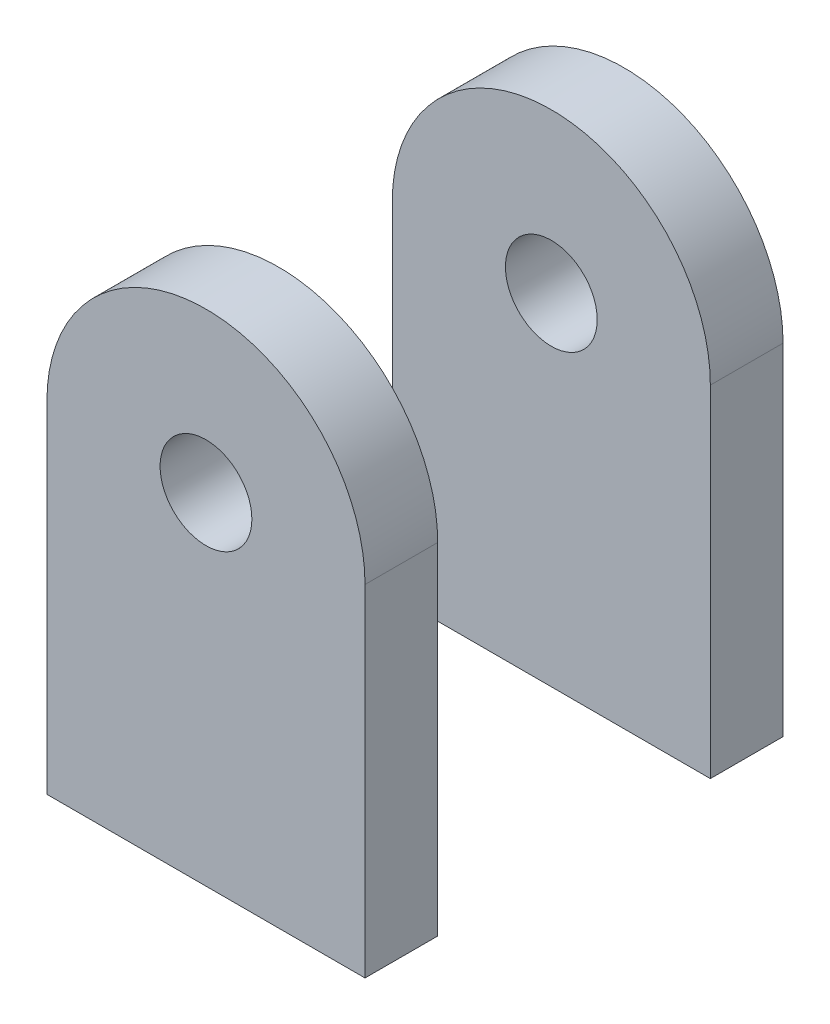
ISO-10303-21;
HEADER;
FILE_DESCRIPTION(('STEP AP214'),'2;1');
FILE_NAME('part.step','',(''),(''),'','','');
FILE_SCHEMA(('AUTOMOTIVE_DESIGN { 1 0 10303 214 1 1 1 1 }'));
ENDSEC;
DATA;
#1=APPLICATION_CONTEXT('core data for automotive mechanical design processes');
#2=APPLICATION_PROTOCOL_DEFINITION('international standard','automotive_design',2000,#1);
#3=PRODUCT_CONTEXT('',#1,'mechanical');
#4=PRODUCT('Part','Part','',(#3));
#5=PRODUCT_RELATED_PRODUCT_CATEGORY('part','',(#4));
#6=PRODUCT_DEFINITION_FORMATION('','',#4);
#7=PRODUCT_DEFINITION_CONTEXT('part definition',#1,'design');
#8=PRODUCT_DEFINITION('design','',#6,#7);
#9=PRODUCT_DEFINITION_SHAPE('','',#8);
#10=(LENGTH_UNIT() NAMED_UNIT(*) SI_UNIT(.MILLI.,.METRE.));
#11=(NAMED_UNIT(*) PLANE_ANGLE_UNIT() SI_UNIT($,.RADIAN.));
#12=(NAMED_UNIT(*) SI_UNIT($,.STERADIAN.) SOLID_ANGLE_UNIT());
#13=UNCERTAINTY_MEASURE_WITH_UNIT(LENGTH_MEASURE(1.E-05),#10,'distance_accuracy_value','');
#14=(GEOMETRIC_REPRESENTATION_CONTEXT(3) GLOBAL_UNCERTAINTY_ASSIGNED_CONTEXT((#13)) GLOBAL_UNIT_ASSIGNED_CONTEXT((#10,
#11,#12)) REPRESENTATION_CONTEXT('',''));
#15=CARTESIAN_POINT('',(0.,0.,0.));
#16=DIRECTION('',(0.,0.,1.));
#17=DIRECTION('',(1.,0.,0.));
#18=AXIS2_PLACEMENT_3D('',#15,#16,#17);
#19=CARTESIAN_POINT('',(-17.5,0.,-38.));
#20=DIRECTION('',(0.,-1.,0.));
#21=DIRECTION('',(0.,0.,-1.));
#22=AXIS2_PLACEMENT_3D('',#19,#20,#21);
#23=PLANE('',#22);
#24=DIRECTION('',(1.,0.,0.));
#25=VECTOR('',#24,1.);
#26=CARTESIAN_POINT('',(-17.5,0.,-30.));
#27=LINE('',#26,#25);
#28=CARTESIAN_POINT('',(-17.5,0.,-30.));
#29=VERTEX_POINT('',#28);
#30=CARTESIAN_POINT('',(17.5,0.,-30.));
#31=VERTEX_POINT('',#30);
#32=EDGE_CURVE('E108',#29,#31,#27,.T.);
#33=ORIENTED_EDGE('',*,*,#32,.F.);
#34=DIRECTION('',(0.,0.,1.));
#35=VECTOR('',#34,1.);
#36=CARTESIAN_POINT('',(-17.5,0.,-38.));
#37=LINE('',#36,#35);
#38=CARTESIAN_POINT('',(-17.5,0.,-38.));
#39=VERTEX_POINT('',#38);
#40=EDGE_CURVE('E12',#39,#29,#37,.T.);
#41=ORIENTED_EDGE('',*,*,#40,.F.);
#42=DIRECTION('',(1.,0.,0.));
#43=VECTOR('',#42,1.);
#44=CARTESIAN_POINT('',(-17.5,0.,-38.));
#45=LINE('',#44,#43);
#46=CARTESIAN_POINT('',(17.5,0.,-38.));
#47=VERTEX_POINT('',#46);
#48=EDGE_CURVE('E101',#39,#47,#45,.T.);
#49=ORIENTED_EDGE('',*,*,#48,.T.);
#50=DIRECTION('',(0.,0.,1.));
#51=VECTOR('',#50,1.);
#52=CARTESIAN_POINT('',(17.5,0.,-38.));
#53=LINE('',#52,#51);
#54=EDGE_CURVE('E46',#47,#31,#53,.T.);
#55=ORIENTED_EDGE('',*,*,#54,.T.);
#56=EDGE_LOOP('',(#33,#41,#49,#55));
#57=FACE_BOUND('',#56,.T.);
#58=ADVANCED_FACE('F43',(#57),#23,.T.);
#59=CARTESIAN_POINT('',(-17.5,37.5,-38.));
#60=DIRECTION('',(-1.,0.,0.));
#61=DIRECTION('',(0.,0.,1.));
#62=AXIS2_PLACEMENT_3D('',#59,#60,#61);
#63=PLANE('',#62);
#64=DIRECTION('',(0.,-1.,0.));
#65=VECTOR('',#64,1.);
#66=CARTESIAN_POINT('',(-17.5,37.5,-30.));
#67=LINE('',#66,#65);
#68=CARTESIAN_POINT('',(-17.5,37.5,-30.));
#69=VERTEX_POINT('',#68);
#70=EDGE_CURVE('E103',#69,#29,#67,.T.);
#71=ORIENTED_EDGE('',*,*,#70,.F.);
#72=DIRECTION('',(0.,0.,1.));
#73=VECTOR('',#72,1.);
#74=CARTESIAN_POINT('',(-17.5,37.5,-38.));
#75=LINE('',#74,#73);
#76=CARTESIAN_POINT('',(-17.5,37.5,-38.));
#77=VERTEX_POINT('',#76);
#78=EDGE_CURVE('E52',#77,#69,#75,.T.);
#79=ORIENTED_EDGE('',*,*,#78,.F.);
#80=DIRECTION('',(0.,-1.,0.));
#81=VECTOR('',#80,1.);
#82=CARTESIAN_POINT('',(-17.5,37.5,-38.));
#83=LINE('',#82,#81);
#84=EDGE_CURVE('E98',#77,#39,#83,.T.);
#85=ORIENTED_EDGE('',*,*,#84,.T.);
#86=ORIENTED_EDGE('',*,*,#40,.T.);
#87=EDGE_LOOP('',(#71,#79,#85,#86));
#88=FACE_BOUND('',#87,.T.);
#89=ADVANCED_FACE('F119',(#88),#63,.T.);
#90=CARTESIAN_POINT('',(0.,37.5,-38.));
#91=DIRECTION('',(0.,0.,1.));
#92=DIRECTION('',(1.,0.,0.));
#93=AXIS2_PLACEMENT_3D('',#90,#91,#92);
#94=CYLINDRICAL_SURFACE('',#93,17.5);
#95=CARTESIAN_POINT('',(0.,37.5,-30.));
#96=DIRECTION('',(0.,0.,1.));
#97=DIRECTION('',(1.,0.,0.));
#98=AXIS2_PLACEMENT_3D('',#95,#96,#97);
#99=CIRCLE('',#98,17.5);
#100=CARTESIAN_POINT('',(17.5,37.5,-30.));
#101=VERTEX_POINT('',#100);
#102=EDGE_CURVE('E93',#101,#69,#99,.T.);
#103=ORIENTED_EDGE('',*,*,#102,.F.);
#104=DIRECTION('',(0.,0.,1.));
#105=VECTOR('',#104,1.);
#106=CARTESIAN_POINT('',(17.5,37.5,-38.));
#107=LINE('',#106,#105);
#108=CARTESIAN_POINT('',(17.5,37.5,-38.));
#109=VERTEX_POINT('',#108);
#110=EDGE_CURVE('E88',#109,#101,#107,.T.);
#111=ORIENTED_EDGE('',*,*,#110,.F.);
#112=CARTESIAN_POINT('',(0.,37.5,-38.));
#113=DIRECTION('',(0.,0.,1.));
#114=DIRECTION('',(1.,0.,0.));
#115=AXIS2_PLACEMENT_3D('',#112,#113,#114);
#116=CIRCLE('',#115,17.5);
#117=EDGE_CURVE('E91',#109,#77,#116,.T.);
#118=ORIENTED_EDGE('',*,*,#117,.T.);
#119=ORIENTED_EDGE('',*,*,#78,.T.);
#120=EDGE_LOOP('',(#103,#111,#118,#119));
#121=FACE_BOUND('',#120,.T.);
#122=ADVANCED_FACE('F90',(#121),#94,.T.);
#123=CARTESIAN_POINT('',(17.5,0.,-38.));
#124=DIRECTION('',(1.,0.,0.));
#125=DIRECTION('',(0.,0.,-1.));
#126=AXIS2_PLACEMENT_3D('',#123,#124,#125);
#127=PLANE('',#126);
#128=DIRECTION('',(0.,1.,0.));
#129=VECTOR('',#128,1.);
#130=CARTESIAN_POINT('',(17.5,0.,-30.));
#131=LINE('',#130,#129);
#132=EDGE_CURVE('E111',#31,#101,#131,.T.);
#133=ORIENTED_EDGE('',*,*,#132,.F.);
#134=ORIENTED_EDGE('',*,*,#54,.F.);
#135=DIRECTION('',(0.,1.,0.));
#136=VECTOR('',#135,1.);
#137=CARTESIAN_POINT('',(17.5,0.,-38.));
#138=LINE('',#137,#136);
#139=EDGE_CURVE('E97',#47,#109,#138,.T.);
#140=ORIENTED_EDGE('',*,*,#139,.T.);
#141=ORIENTED_EDGE('',*,*,#110,.T.);
#142=EDGE_LOOP('',(#133,#134,#140,#141));
#143=FACE_BOUND('',#142,.T.);
#144=ADVANCED_FACE('F100',(#143),#127,.T.);
#145=CARTESIAN_POINT('',(0.,37.5,-38.));
#146=DIRECTION('',(0.,0.,1.));
#147=DIRECTION('',(1.,0.,0.));
#148=AXIS2_PLACEMENT_3D('',#145,#146,#147);
#149=PLANE('',#148);
#150=CARTESIAN_POINT('',(0.,37.5,-38.));
#151=DIRECTION('',(0.,0.,1.));
#152=DIRECTION('',(1.,0.,0.));
#153=AXIS2_PLACEMENT_3D('',#150,#151,#152);
#154=CIRCLE('',#153,5.05);
#155=CARTESIAN_POINT('',(5.05,37.5,-38.));
#156=VERTEX_POINT('',#155);
#157=EDGE_CURVE('E112',#156,#156,#154,.T.);
#158=ORIENTED_EDGE('',*,*,#157,.T.);
#159=EDGE_LOOP('',(#158));
#160=FACE_BOUND('',#159,.T.);
#161=ORIENTED_EDGE('',*,*,#48,.F.);
#162=ORIENTED_EDGE('',*,*,#84,.F.);
#163=ORIENTED_EDGE('',*,*,#117,.F.);
#164=ORIENTED_EDGE('',*,*,#139,.F.);
#165=EDGE_LOOP('',(#161,#162,#163,#164));
#166=FACE_BOUND('',#165,.T.);
#167=ADVANCED_FACE('F96',(#160,#166),#149,.F.);
#168=CARTESIAN_POINT('',(0.,37.5,-30.));
#169=DIRECTION('',(0.,0.,1.));
#170=DIRECTION('',(1.,0.,0.));
#171=AXIS2_PLACEMENT_3D('',#168,#169,#170);
#172=PLANE('',#171);
#173=CARTESIAN_POINT('',(0.,37.5,-30.));
#174=DIRECTION('',(0.,0.,1.));
#175=DIRECTION('',(1.,0.,0.));
#176=AXIS2_PLACEMENT_3D('',#173,#174,#175);
#177=CIRCLE('',#176,5.05);
#178=CARTESIAN_POINT('',(5.05,37.5,-30.));
#179=VERTEX_POINT('',#178);
#180=EDGE_CURVE('E149',#179,#179,#177,.T.);
#181=ORIENTED_EDGE('',*,*,#180,.F.);
#182=EDGE_LOOP('',(#181));
#183=FACE_BOUND('',#182,.T.);
#184=ORIENTED_EDGE('',*,*,#32,.T.);
#185=ORIENTED_EDGE('',*,*,#132,.T.);
#186=ORIENTED_EDGE('',*,*,#102,.T.);
#187=ORIENTED_EDGE('',*,*,#70,.T.);
#188=EDGE_LOOP('',(#184,#185,#186,#187));
#189=FACE_BOUND('',#188,.T.);
#190=ADVANCED_FACE('F118',(#183,#189),#172,.T.);
#191=CARTESIAN_POINT('',(0.,37.5,-38.));
#192=DIRECTION('',(0.,0.,1.));
#193=DIRECTION('',(1.,0.,0.));
#194=AXIS2_PLACEMENT_3D('',#191,#192,#193);
#195=CYLINDRICAL_SURFACE('',#194,5.05);
#196=ORIENTED_EDGE('',*,*,#157,.F.);
#197=EDGE_LOOP('',(#196));
#198=FACE_BOUND('',#197,.T.);
#199=ORIENTED_EDGE('',*,*,#180,.T.);
#200=EDGE_LOOP('',(#199));
#201=FACE_BOUND('',#200,.T.);
#202=ADVANCED_FACE('F137',(#198,#201),#195,.F.);
#203=CLOSED_SHELL('',(#58,#89,#122,#144,#167,#190,#202));
#204=MANIFOLD_SOLID_BREP('B2',#203);
#205=CARTESIAN_POINT('',(0.,37.5,8.));
#206=DIRECTION('',(0.,0.,-1.));
#207=DIRECTION('',(-1.,0.,0.));
#208=AXIS2_PLACEMENT_3D('',#205,#206,#207);
#209=PLANE('',#208);
#210=DIRECTION('',(0.,-1.,0.));
#211=VECTOR('',#210,1.);
#212=CARTESIAN_POINT('',(-17.5,0.,8.));
#213=LINE('',#212,#211);
#214=CARTESIAN_POINT('',(-17.5,37.5,8.));
#215=VERTEX_POINT('',#214);
#216=CARTESIAN_POINT('',(-17.5,0.,8.));
#217=VERTEX_POINT('',#216);
#218=EDGE_CURVE('E240',#215,#217,#213,.T.);
#219=ORIENTED_EDGE('',*,*,#218,.T.);
#220=DIRECTION('',(1.,0.,0.));
#221=VECTOR('',#220,1.);
#222=CARTESIAN_POINT('',(-17.5,0.,8.));
#223=LINE('',#222,#221);
#224=CARTESIAN_POINT('',(17.5,0.,8.));
#225=VERTEX_POINT('',#224);
#226=EDGE_CURVE('E235',#217,#225,#223,.T.);
#227=ORIENTED_EDGE('',*,*,#226,.T.);
#228=DIRECTION('',(0.,1.,0.));
#229=VECTOR('',#228,1.);
#230=CARTESIAN_POINT('',(17.5,0.,8.));
#231=LINE('',#230,#229);
#232=CARTESIAN_POINT('',(17.5,37.5,8.));
#233=VERTEX_POINT('',#232);
#234=EDGE_CURVE('E238',#225,#233,#231,.T.);
#235=ORIENTED_EDGE('',*,*,#234,.T.);
#236=CARTESIAN_POINT('',(0.,37.5,8.));
#237=DIRECTION('',(0.,0.,1.));
#238=DIRECTION('',(-1.,0.,0.));
#239=AXIS2_PLACEMENT_3D('',#236,#237,#238);
#240=CIRCLE('',#239,17.5);
#241=EDGE_CURVE('E205',#233,#215,#240,.T.);
#242=ORIENTED_EDGE('',*,*,#241,.T.);
#243=EDGE_LOOP('',(#219,#227,#235,#242));
#244=FACE_BOUND('',#243,.T.);
#245=CARTESIAN_POINT('',(0.,37.5,8.));
#246=DIRECTION('',(0.,0.,1.));
#247=DIRECTION('',(1.,0.,0.));
#248=AXIS2_PLACEMENT_3D('',#245,#246,#247);
#249=CIRCLE('',#248,5.05);
#250=CARTESIAN_POINT('',(5.05,37.5,8.));
#251=VERTEX_POINT('',#250);
#252=EDGE_CURVE('E255',#251,#251,#249,.T.);
#253=ORIENTED_EDGE('',*,*,#252,.F.);
#254=EDGE_LOOP('',(#253));
#255=FACE_BOUND('',#254,.T.);
#256=ADVANCED_FACE('F188',(#244,#255),#209,.F.);
#257=CARTESIAN_POINT('',(0.,37.5,0.));
#258=DIRECTION('',(0.,0.,-1.));
#259=DIRECTION('',(-1.,0.,0.));
#260=AXIS2_PLACEMENT_3D('',#257,#258,#259);
#261=PLANE('',#260);
#262=DIRECTION('',(0.,-1.,0.));
#263=VECTOR('',#262,1.);
#264=CARTESIAN_POINT('',(-17.5,0.,0.));
#265=LINE('',#264,#263);
#266=CARTESIAN_POINT('',(-17.5,37.5,0.));
#267=VERTEX_POINT('',#266);
#268=CARTESIAN_POINT('',(-17.5,0.,0.));
#269=VERTEX_POINT('',#268);
#270=EDGE_CURVE('E252',#267,#269,#265,.T.);
#271=ORIENTED_EDGE('',*,*,#270,.F.);
#272=CARTESIAN_POINT('',(0.,37.5,0.));
#273=DIRECTION('',(0.,0.,1.));
#274=DIRECTION('',(-1.,0.,0.));
#275=AXIS2_PLACEMENT_3D('',#272,#273,#274);
#276=CIRCLE('',#275,17.5);
#277=CARTESIAN_POINT('',(17.5,37.5,0.));
#278=VERTEX_POINT('',#277);
#279=EDGE_CURVE('E228',#278,#267,#276,.T.);
#280=ORIENTED_EDGE('',*,*,#279,.F.);
#281=DIRECTION('',(0.,1.,0.));
#282=VECTOR('',#281,1.);
#283=CARTESIAN_POINT('',(17.5,0.,0.));
#284=LINE('',#283,#282);
#285=CARTESIAN_POINT('',(17.5,0.,0.));
#286=VERTEX_POINT('',#285);
#287=EDGE_CURVE('E222',#286,#278,#284,.T.);
#288=ORIENTED_EDGE('',*,*,#287,.F.);
#289=DIRECTION('',(1.,0.,0.));
#290=VECTOR('',#289,1.);
#291=CARTESIAN_POINT('',(-17.5,0.,0.));
#292=LINE('',#291,#290);
#293=EDGE_CURVE('E244',#269,#286,#292,.T.);
#294=ORIENTED_EDGE('',*,*,#293,.F.);
#295=EDGE_LOOP('',(#271,#280,#288,#294));
#296=FACE_BOUND('',#295,.T.);
#297=CARTESIAN_POINT('',(0.,37.5,0.));
#298=DIRECTION('',(0.,0.,1.));
#299=DIRECTION('',(1.,0.,0.));
#300=AXIS2_PLACEMENT_3D('',#297,#298,#299);
#301=CIRCLE('',#300,5.05);
#302=CARTESIAN_POINT('',(5.05,37.5,0.));
#303=VERTEX_POINT('',#302);
#304=EDGE_CURVE('E267',#303,#303,#301,.T.);
#305=ORIENTED_EDGE('',*,*,#304,.T.);
#306=EDGE_LOOP('',(#305));
#307=FACE_BOUND('',#306,.T.);
#308=ADVANCED_FACE('F263',(#296,#307),#261,.T.);
#309=CARTESIAN_POINT('',(-17.5,0.,8.));
#310=DIRECTION('',(1.,0.,0.));
#311=DIRECTION('',(0.,0.,-1.));
#312=AXIS2_PLACEMENT_3D('',#309,#310,#311);
#313=PLANE('',#312);
#314=ORIENTED_EDGE('',*,*,#270,.T.);
#315=DIRECTION('',(0.,0.,-1.));
#316=VECTOR('',#315,1.);
#317=CARTESIAN_POINT('',(-17.5,0.,8.));
#318=LINE('',#317,#316);
#319=EDGE_CURVE('E41',#217,#269,#318,.T.);
#320=ORIENTED_EDGE('',*,*,#319,.F.);
#321=ORIENTED_EDGE('',*,*,#218,.F.);
#322=DIRECTION('',(0.,0.,-1.));
#323=VECTOR('',#322,1.);
#324=CARTESIAN_POINT('',(-17.5,37.5,8.));
#325=LINE('',#324,#323);
#326=EDGE_CURVE('E248',#215,#267,#325,.T.);
#327=ORIENTED_EDGE('',*,*,#326,.T.);
#328=EDGE_LOOP('',(#314,#320,#321,#327));
#329=FACE_BOUND('',#328,.T.);
#330=ADVANCED_FACE('F190',(#329),#313,.F.);
#331=CARTESIAN_POINT('',(-17.5,0.,8.));
#332=DIRECTION('',(0.,1.,0.));
#333=DIRECTION('',(0.,0.,1.));
#334=AXIS2_PLACEMENT_3D('',#331,#332,#333);
#335=PLANE('',#334);
#336=ORIENTED_EDGE('',*,*,#293,.T.);
#337=DIRECTION('',(0.,0.,-1.));
#338=VECTOR('',#337,1.);
#339=CARTESIAN_POINT('',(17.5,0.,8.));
#340=LINE('',#339,#338);
#341=EDGE_CURVE('E197',#225,#286,#340,.T.);
#342=ORIENTED_EDGE('',*,*,#341,.F.);
#343=ORIENTED_EDGE('',*,*,#226,.F.);
#344=ORIENTED_EDGE('',*,*,#319,.T.);
#345=EDGE_LOOP('',(#336,#342,#343,#344));
#346=FACE_BOUND('',#345,.T.);
#347=ADVANCED_FACE('F243',(#346),#335,.F.);
#348=CARTESIAN_POINT('',(17.5,0.,8.));
#349=DIRECTION('',(-1.,0.,0.));
#350=DIRECTION('',(0.,0.,1.));
#351=AXIS2_PLACEMENT_3D('',#348,#349,#350);
#352=PLANE('',#351);
#353=ORIENTED_EDGE('',*,*,#287,.T.);
#354=DIRECTION('',(0.,0.,-1.));
#355=VECTOR('',#354,1.);
#356=CARTESIAN_POINT('',(17.5,37.5,8.));
#357=LINE('',#356,#355);
#358=EDGE_CURVE('E245',#233,#278,#357,.T.);
#359=ORIENTED_EDGE('',*,*,#358,.F.);
#360=ORIENTED_EDGE('',*,*,#234,.F.);
#361=ORIENTED_EDGE('',*,*,#341,.T.);
#362=EDGE_LOOP('',(#353,#359,#360,#361));
#363=FACE_BOUND('',#362,.T.);
#364=ADVANCED_FACE('F246',(#363),#352,.F.);
#365=CARTESIAN_POINT('',(0.,37.5,8.));
#366=DIRECTION('',(0.,0.,-1.));
#367=DIRECTION('',(-1.,0.,0.));
#368=AXIS2_PLACEMENT_3D('',#365,#366,#367);
#369=CYLINDRICAL_SURFACE('',#368,17.5);
#370=ORIENTED_EDGE('',*,*,#279,.T.);
#371=ORIENTED_EDGE('',*,*,#326,.F.);
#372=ORIENTED_EDGE('',*,*,#241,.F.);
#373=ORIENTED_EDGE('',*,*,#358,.T.);
#374=EDGE_LOOP('',(#370,#371,#372,#373));
#375=FACE_BOUND('',#374,.T.);
#376=ADVANCED_FACE('F260',(#375),#369,.T.);
#377=CARTESIAN_POINT('',(0.,37.5,8.));
#378=DIRECTION('',(0.,0.,-1.));
#379=DIRECTION('',(-1.,0.,0.));
#380=AXIS2_PLACEMENT_3D('',#377,#378,#379);
#381=CYLINDRICAL_SURFACE('',#380,5.05);
#382=ORIENTED_EDGE('',*,*,#252,.T.);
#383=EDGE_LOOP('',(#382));
#384=FACE_BOUND('',#383,.T.);
#385=ORIENTED_EDGE('',*,*,#304,.F.);
#386=EDGE_LOOP('',(#385));
#387=FACE_BOUND('',#386,.T.);
#388=ADVANCED_FACE('F273',(#384,#387),#381,.F.);
#389=CLOSED_SHELL('',(#256,#308,#330,#347,#364,#376,#388));
#390=MANIFOLD_SOLID_BREP('B6',#389);
#391=ADVANCED_BREP_SHAPE_REPRESENTATION('',(#18,#204,#390),#14);
#392=SHAPE_DEFINITION_REPRESENTATION(#9,#391);
ENDSEC;
END-ISO-10303-21;
